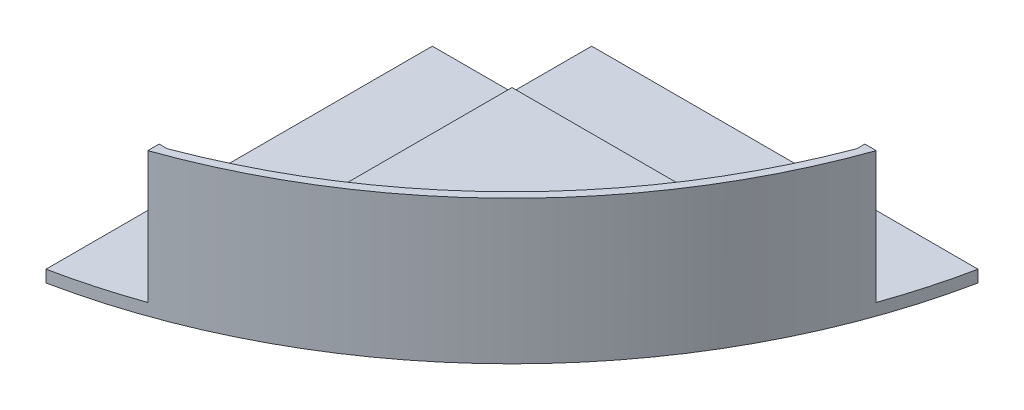
ISO-10303-21;
HEADER;
FILE_DESCRIPTION(('STEP AP214'),'2;1');
FILE_NAME('part.step','',(''),(''),'','','');
FILE_SCHEMA(('AUTOMOTIVE_DESIGN { 1 0 10303 214 1 1 1 1 }'));
ENDSEC;
DATA;
#1=APPLICATION_CONTEXT('core data for automotive mechanical design processes');
#2=APPLICATION_PROTOCOL_DEFINITION('international standard','automotive_design',2000,#1);
#3=PRODUCT_CONTEXT('',#1,'mechanical');
#4=PRODUCT('Part','Part','',(#3));
#5=PRODUCT_RELATED_PRODUCT_CATEGORY('part','',(#4));
#6=PRODUCT_DEFINITION_FORMATION('','',#4);
#7=PRODUCT_DEFINITION_CONTEXT('part definition',#1,'design');
#8=PRODUCT_DEFINITION('design','',#6,#7);
#9=PRODUCT_DEFINITION_SHAPE('','',#8);
#10=(LENGTH_UNIT() NAMED_UNIT(*) SI_UNIT(.MILLI.,.METRE.));
#11=(NAMED_UNIT(*) PLANE_ANGLE_UNIT() SI_UNIT($,.RADIAN.));
#12=(NAMED_UNIT(*) SI_UNIT($,.STERADIAN.) SOLID_ANGLE_UNIT());
#13=UNCERTAINTY_MEASURE_WITH_UNIT(LENGTH_MEASURE(1.E-05),#10,'distance_accuracy_value','');
#14=(GEOMETRIC_REPRESENTATION_CONTEXT(3) GLOBAL_UNCERTAINTY_ASSIGNED_CONTEXT((#13)) GLOBAL_UNIT_ASSIGNED_CONTEXT((#10,
#11,#12)) REPRESENTATION_CONTEXT('',''));
#15=CARTESIAN_POINT('',(0.,0.,0.));
#16=DIRECTION('',(0.,0.,1.));
#17=DIRECTION('',(1.,0.,0.));
#18=AXIS2_PLACEMENT_3D('',#15,#16,#17);
#19=CARTESIAN_POINT('',(0.,3.,0.));
#20=DIRECTION('',(0.,-1.,0.));
#21=DIRECTION('',(0.,0.,-1.));
#22=AXIS2_PLACEMENT_3D('',#19,#20,#21);
#23=CYLINDRICAL_SURFACE('',#22,148.);
#24=DIRECTION('',(0.,-1.,0.));
#25=VECTOR('',#24,1.);
#26=CARTESIAN_POINT('',(138.56406460551,36.,52.));
#27=LINE('',#26,#25);
#28=CARTESIAN_POINT('',(138.56406460551,36.,52.));
#29=VERTEX_POINT('',#28);
#30=CARTESIAN_POINT('',(138.56406460551,6.,52.));
#31=VERTEX_POINT('',#30);
#32=EDGE_CURVE('E168',#29,#31,#27,.T.);
#33=ORIENTED_EDGE('',*,*,#32,.T.);
#34=CARTESIAN_POINT('',(-1.27675647831893E-12,6.,-1.27675647831893E-12));
#35=DIRECTION('',(0.,-1.,0.));
#36=DIRECTION('',(0.,0.,-1.));
#37=AXIS2_PLACEMENT_3D('',#34,#35,#36);
#38=CIRCLE('',#37,148.000000000002);
#39=CARTESIAN_POINT('',(52.,6.,138.56406460551));
#40=VERTEX_POINT('',#39);
#41=EDGE_CURVE('E159',#40,#31,#38,.F.);
#42=ORIENTED_EDGE('',*,*,#41,.F.);
#43=DIRECTION('',(0.,-1.,0.));
#44=VECTOR('',#43,1.);
#45=CARTESIAN_POINT('',(52.,36.,138.56406460551));
#46=LINE('',#45,#44);
#47=CARTESIAN_POINT('',(52.,36.,138.56406460551));
#48=VERTEX_POINT('',#47);
#49=EDGE_CURVE('E166',#48,#40,#46,.T.);
#50=ORIENTED_EDGE('',*,*,#49,.F.);
#51=CARTESIAN_POINT('',(0.,36.,0.));
#52=DIRECTION('',(0.,1.,0.));
#53=DIRECTION('',(0.,0.,1.));
#54=AXIS2_PLACEMENT_3D('',#51,#52,#53);
#55=CIRCLE('',#54,148.);
#56=EDGE_CURVE('E174',#48,#29,#55,.T.);
#57=ORIENTED_EDGE('',*,*,#56,.T.);
#58=EDGE_LOOP('',(#33,#42,#50,#57));
#59=FACE_BOUND('',#58,.T.);
#60=ADVANCED_FACE('F37',(#59),#23,.F.);
#61=CARTESIAN_POINT('',(-40.3230520964318,36.,88.4846922834953));
#62=DIRECTION('',(0.,1.,0.));
#63=DIRECTION('',(0.,0.,1.));
#64=AXIS2_PLACEMENT_3D('',#61,#62,#63);
#65=PLANE('',#64);
#66=DIRECTION('',(1.,0.,0.));
#67=VECTOR('',#66,1.);
#68=CARTESIAN_POINT('',(49.,36.,138.56406460551));
#69=LINE('',#68,#67);
#70=CARTESIAN_POINT('',(50.,36.,138.56406460551));
#71=VERTEX_POINT('',#70);
#72=EDGE_CURVE('E172',#71,#48,#69,.T.);
#73=ORIENTED_EDGE('',*,*,#72,.F.);
#74=DIRECTION('',(0.,0.,1.));
#75=VECTOR('',#74,1.);
#76=CARTESIAN_POINT('',(50.,36.,88.4846922834953));
#77=LINE('',#76,#75);
#78=CARTESIAN_POINT('',(50.,36.,141.42135623731));
#79=VERTEX_POINT('',#78);
#80=EDGE_CURVE('E182',#71,#79,#77,.T.);
#81=ORIENTED_EDGE('',*,*,#80,.T.);
#82=CARTESIAN_POINT('',(0.,36.,0.));
#83=DIRECTION('',(0.,1.,0.));
#84=DIRECTION('',(0.,0.,1.));
#85=AXIS2_PLACEMENT_3D('',#82,#83,#84);
#86=CIRCLE('',#85,150.);
#87=CARTESIAN_POINT('',(141.42135623731,36.,50.));
#88=VERTEX_POINT('',#87);
#89=EDGE_CURVE('E184',#79,#88,#86,.T.);
#90=ORIENTED_EDGE('',*,*,#89,.T.);
#91=DIRECTION('',(1.,0.,0.));
#92=VECTOR('',#91,1.);
#93=CARTESIAN_POINT('',(-40.3230520964318,36.,50.));
#94=LINE('',#93,#92);
#95=CARTESIAN_POINT('',(138.56406460551,36.,50.));
#96=VERTEX_POINT('',#95);
#97=EDGE_CURVE('E180',#96,#88,#94,.T.);
#98=ORIENTED_EDGE('',*,*,#97,.F.);
#99=DIRECTION('',(0.,0.,1.));
#100=VECTOR('',#99,1.);
#101=CARTESIAN_POINT('',(138.56406460551,36.,49.));
#102=LINE('',#101,#100);
#103=EDGE_CURVE('E306',#96,#29,#102,.T.);
#104=ORIENTED_EDGE('',*,*,#103,.T.);
#105=ORIENTED_EDGE('',*,*,#56,.F.);
#106=EDGE_LOOP('',(#73,#81,#90,#98,#104,#105));
#107=FACE_BOUND('',#106,.T.);
#108=ADVANCED_FACE('F259',(#107),#65,.T.);
#109=CARTESIAN_POINT('',(50.,3.,88.4846922834954));
#110=DIRECTION('',(1.,0.,0.));
#111=DIRECTION('',(0.,0.,-1.));
#112=AXIS2_PLACEMENT_3D('',#109,#110,#111);
#113=PLANE('',#112);
#114=DIRECTION('',(0.,0.,1.));
#115=VECTOR('',#114,1.);
#116=CARTESIAN_POINT('',(50.,0.,88.4846922834954));
#117=LINE('',#116,#115);
#118=CARTESIAN_POINT('',(50.,0.,30.));
#119=VERTEX_POINT('',#118);
#120=CARTESIAN_POINT('',(50.,0.,50.));
#121=VERTEX_POINT('',#120);
#122=EDGE_CURVE('E225',#119,#121,#117,.T.);
#123=ORIENTED_EDGE('',*,*,#122,.T.);
#124=DIRECTION('',(0.,-1.,0.));
#125=VECTOR('',#124,1.);
#126=CARTESIAN_POINT('',(50.,3.,50.));
#127=LINE('',#126,#125);
#128=CARTESIAN_POINT('',(50.,3.,50.));
#129=VERTEX_POINT('',#128);
#130=EDGE_CURVE('E11',#129,#121,#127,.T.);
#131=ORIENTED_EDGE('',*,*,#130,.F.);
#132=DIRECTION('',(0.,0.,1.));
#133=VECTOR('',#132,1.);
#134=CARTESIAN_POINT('',(50.,3.,88.4846922834954));
#135=LINE('',#134,#133);
#136=CARTESIAN_POINT('',(50.,3.,30.));
#137=VERTEX_POINT('',#136);
#138=EDGE_CURVE('E189',#137,#129,#135,.T.);
#139=ORIENTED_EDGE('',*,*,#138,.F.);
#140=DIRECTION('',(0.,-1.,0.));
#141=VECTOR('',#140,1.);
#142=CARTESIAN_POINT('',(50.,3.,30.));
#143=LINE('',#142,#141);
#144=EDGE_CURVE('E64',#137,#119,#143,.T.);
#145=ORIENTED_EDGE('',*,*,#144,.T.);
#146=EDGE_LOOP('',(#123,#131,#139,#145));
#147=FACE_BOUND('',#146,.T.);
#148=ADVANCED_FACE('F39',(#147),#113,.F.);
#149=CARTESIAN_POINT('',(-40.3230520964318,3.,50.));
#150=DIRECTION('',(0.,0.,-1.));
#151=DIRECTION('',(-1.,0.,0.));
#152=AXIS2_PLACEMENT_3D('',#149,#150,#151);
#153=PLANE('',#152);
#154=DIRECTION('',(1.,0.,0.));
#155=VECTOR('',#154,1.);
#156=CARTESIAN_POINT('',(-40.3230520964318,0.,50.));
#157=LINE('',#156,#155);
#158=CARTESIAN_POINT('',(30.,0.,50.));
#159=VERTEX_POINT('',#158);
#160=EDGE_CURVE('E223',#159,#121,#157,.T.);
#161=ORIENTED_EDGE('',*,*,#160,.F.);
#162=DIRECTION('',(0.,-1.,0.));
#163=VECTOR('',#162,1.);
#164=CARTESIAN_POINT('',(30.,3.,50.));
#165=LINE('',#164,#163);
#166=CARTESIAN_POINT('',(30.,3.,50.));
#167=VERTEX_POINT('',#166);
#168=EDGE_CURVE('E47',#167,#159,#165,.T.);
#169=ORIENTED_EDGE('',*,*,#168,.F.);
#170=DIRECTION('',(1.,0.,0.));
#171=VECTOR('',#170,1.);
#172=CARTESIAN_POINT('',(-40.3230520964318,3.,50.));
#173=LINE('',#172,#171);
#174=EDGE_CURVE('E192',#167,#129,#173,.T.);
#175=ORIENTED_EDGE('',*,*,#174,.T.);
#176=ORIENTED_EDGE('',*,*,#130,.T.);
#177=EDGE_LOOP('',(#161,#169,#175,#176));
#178=FACE_BOUND('',#177,.T.);
#179=ADVANCED_FACE('F257',(#178),#153,.T.);
#180=CARTESIAN_POINT('',(30.,3.,88.4846922834954));
#181=DIRECTION('',(1.,0.,0.));
#182=DIRECTION('',(0.,0.,-1.));
#183=AXIS2_PLACEMENT_3D('',#180,#181,#182);
#184=PLANE('',#183);
#185=DIRECTION('',(0.,0.,1.));
#186=VECTOR('',#185,1.);
#187=CARTESIAN_POINT('',(30.,0.,88.4846922834954));
#188=LINE('',#187,#186);
#189=CARTESIAN_POINT('',(30.,0.,146.969384566991));
#190=VERTEX_POINT('',#189);
#191=EDGE_CURVE('E221',#159,#190,#188,.T.);
#192=ORIENTED_EDGE('',*,*,#191,.T.);
#193=DIRECTION('',(0.,-1.,0.));
#194=VECTOR('',#193,1.);
#195=CARTESIAN_POINT('',(30.,3.,146.969384566991));
#196=LINE('',#195,#194);
#197=CARTESIAN_POINT('',(30.,3.,146.969384566991));
#198=VERTEX_POINT('',#197);
#199=EDGE_CURVE('E210',#198,#190,#196,.T.);
#200=ORIENTED_EDGE('',*,*,#199,.F.);
#201=DIRECTION('',(0.,0.,1.));
#202=VECTOR('',#201,1.);
#203=CARTESIAN_POINT('',(30.,3.,88.4846922834954));
#204=LINE('',#203,#202);
#205=EDGE_CURVE('E195',#167,#198,#204,.T.);
#206=ORIENTED_EDGE('',*,*,#205,.F.);
#207=ORIENTED_EDGE('',*,*,#168,.T.);
#208=EDGE_LOOP('',(#192,#200,#206,#207));
#209=FACE_BOUND('',#208,.T.);
#210=ADVANCED_FACE('F264',(#209),#184,.F.);
#211=CARTESIAN_POINT('',(0.,3.,0.));
#212=DIRECTION('',(0.,-1.,0.));
#213=DIRECTION('',(0.,0.,-1.));
#214=AXIS2_PLACEMENT_3D('',#211,#212,#213);
#215=CYLINDRICAL_SURFACE('',#214,150.);
#216=CARTESIAN_POINT('',(0.,0.,0.));
#217=DIRECTION('',(0.,1.,0.));
#218=DIRECTION('',(0.,0.,1.));
#219=AXIS2_PLACEMENT_3D('',#216,#217,#218);
#220=CIRCLE('',#219,150.);
#221=CARTESIAN_POINT('',(146.969384566991,0.,30.));
#222=VERTEX_POINT('',#221);
#223=EDGE_CURVE('E218',#190,#222,#220,.T.);
#224=ORIENTED_EDGE('',*,*,#223,.T.);
#225=DIRECTION('',(0.,-1.,0.));
#226=VECTOR('',#225,1.);
#227=CARTESIAN_POINT('',(146.969384566991,3.,30.));
#228=LINE('',#227,#226);
#229=CARTESIAN_POINT('',(146.969384566991,3.,30.));
#230=VERTEX_POINT('',#229);
#231=EDGE_CURVE('E213',#230,#222,#228,.T.);
#232=ORIENTED_EDGE('',*,*,#231,.F.);
#233=CARTESIAN_POINT('',(0.,3.,0.));
#234=DIRECTION('',(0.,1.,0.));
#235=DIRECTION('',(0.,0.,1.));
#236=AXIS2_PLACEMENT_3D('',#233,#234,#235);
#237=CIRCLE('',#236,150.);
#238=CARTESIAN_POINT('',(141.42135623731,3.,50.));
#239=VERTEX_POINT('',#238);
#240=EDGE_CURVE('E197',#239,#230,#237,.T.);
#241=ORIENTED_EDGE('',*,*,#240,.F.);
#242=DIRECTION('',(0.,-1.,0.));
#243=VECTOR('',#242,1.);
#244=CARTESIAN_POINT('',(141.42135623731,36.,50.));
#245=LINE('',#244,#243);
#246=EDGE_CURVE('E186',#88,#239,#245,.T.);
#247=ORIENTED_EDGE('',*,*,#246,.F.);
#248=ORIENTED_EDGE('',*,*,#89,.F.);
#249=DIRECTION('',(0.,-1.,0.));
#250=VECTOR('',#249,1.);
#251=CARTESIAN_POINT('',(50.,36.,141.42135623731));
#252=LINE('',#251,#250);
#253=CARTESIAN_POINT('',(50.,3.,141.42135623731));
#254=VERTEX_POINT('',#253);
#255=EDGE_CURVE('E226',#79,#254,#252,.T.);
#256=ORIENTED_EDGE('',*,*,#255,.T.);
#257=EDGE_CURVE('E206',#198,#254,#237,.T.);
#258=ORIENTED_EDGE('',*,*,#257,.F.);
#259=ORIENTED_EDGE('',*,*,#199,.T.);
#260=EDGE_LOOP('',(#224,#232,#241,#247,#248,#256,#258,#259));
#261=FACE_BOUND('',#260,.T.);
#262=ADVANCED_FACE('F246',(#261),#215,.T.);
#263=CARTESIAN_POINT('',(-40.3230520964318,3.,30.));
#264=DIRECTION('',(0.,0.,-1.));
#265=DIRECTION('',(-1.,0.,0.));
#266=AXIS2_PLACEMENT_3D('',#263,#264,#265);
#267=PLANE('',#266);
#268=DIRECTION('',(1.,0.,0.));
#269=VECTOR('',#268,1.);
#270=CARTESIAN_POINT('',(-40.3230520964318,0.,30.));
#271=LINE('',#270,#269);
#272=EDGE_CURVE('E193',#119,#222,#271,.T.);
#273=ORIENTED_EDGE('',*,*,#272,.F.);
#274=ORIENTED_EDGE('',*,*,#144,.F.);
#275=DIRECTION('',(1.,0.,0.));
#276=VECTOR('',#275,1.);
#277=CARTESIAN_POINT('',(-40.3230520964318,3.,30.));
#278=LINE('',#277,#276);
#279=EDGE_CURVE('E200',#137,#230,#278,.T.);
#280=ORIENTED_EDGE('',*,*,#279,.T.);
#281=ORIENTED_EDGE('',*,*,#231,.T.);
#282=EDGE_LOOP('',(#273,#274,#280,#281));
#283=FACE_BOUND('',#282,.T.);
#284=ADVANCED_FACE('F251',(#283),#267,.T.);
#285=CARTESIAN_POINT('',(-40.3230520964318,3.,88.4846922834954));
#286=DIRECTION('',(0.,1.,0.));
#287=DIRECTION('',(0.,0.,1.));
#288=AXIS2_PLACEMENT_3D('',#285,#286,#287);
#289=PLANE('',#288);
#290=ORIENTED_EDGE('',*,*,#138,.T.);
#291=ORIENTED_EDGE('',*,*,#174,.F.);
#292=ORIENTED_EDGE('',*,*,#205,.T.);
#293=ORIENTED_EDGE('',*,*,#257,.T.);
#294=DIRECTION('',(0.,0.,1.));
#295=VECTOR('',#294,1.);
#296=CARTESIAN_POINT('',(50.,3.,88.4846922834953));
#297=LINE('',#296,#295);
#298=CARTESIAN_POINT('',(50.,3.,138.56406460551));
#299=VERTEX_POINT('',#298);
#300=EDGE_CURVE('E41',#299,#254,#297,.T.);
#301=ORIENTED_EDGE('',*,*,#300,.F.);
#302=DIRECTION('',(1.,0.,0.));
#303=VECTOR('',#302,1.);
#304=CARTESIAN_POINT('',(49.,3.,138.56406460551));
#305=LINE('',#304,#303);
#306=CARTESIAN_POINT('',(52.,3.,138.56406460551));
#307=VERTEX_POINT('',#306);
#308=EDGE_CURVE('E294',#299,#307,#305,.T.);
#309=ORIENTED_EDGE('',*,*,#308,.T.);
#310=DIRECTION('',(0.,0.,-1.));
#311=VECTOR('',#310,1.);
#312=CARTESIAN_POINT('',(52.,3.,138.56406460551));
#313=LINE('',#312,#311);
#314=CARTESIAN_POINT('',(52.,3.,52.));
#315=VERTEX_POINT('',#314);
#316=EDGE_CURVE('E149',#307,#315,#313,.T.);
#317=ORIENTED_EDGE('',*,*,#316,.T.);
#318=DIRECTION('',(1.,0.,0.));
#319=VECTOR('',#318,1.);
#320=CARTESIAN_POINT('',(94.2820323027551,3.,52.));
#321=LINE('',#320,#319);
#322=CARTESIAN_POINT('',(138.56406460551,3.,52.));
#323=VERTEX_POINT('',#322);
#324=EDGE_CURVE('E298',#315,#323,#321,.T.);
#325=ORIENTED_EDGE('',*,*,#324,.T.);
#326=DIRECTION('',(0.,0.,1.));
#327=VECTOR('',#326,1.);
#328=CARTESIAN_POINT('',(138.56406460551,3.,49.));
#329=LINE('',#328,#327);
#330=CARTESIAN_POINT('',(138.56406460551,3.,50.));
#331=VERTEX_POINT('',#330);
#332=EDGE_CURVE('E301',#331,#323,#329,.T.);
#333=ORIENTED_EDGE('',*,*,#332,.F.);
#334=DIRECTION('',(1.,0.,0.));
#335=VECTOR('',#334,1.);
#336=CARTESIAN_POINT('',(-40.3230520964318,3.,50.));
#337=LINE('',#336,#335);
#338=EDGE_CURVE('E55',#331,#239,#337,.T.);
#339=ORIENTED_EDGE('',*,*,#338,.T.);
#340=ORIENTED_EDGE('',*,*,#240,.T.);
#341=ORIENTED_EDGE('',*,*,#279,.F.);
#342=EDGE_LOOP('',(#290,#291,#292,#293,#301,#309,#317,#325,#333,#339,#340,#341));
#343=FACE_BOUND('',#342,.T.);
#344=ADVANCED_FACE('F249',(#343),#289,.T.);
#345=CARTESIAN_POINT('',(-40.3230520964318,0.,88.4846922834954));
#346=DIRECTION('',(0.,1.,0.));
#347=DIRECTION('',(0.,0.,1.));
#348=AXIS2_PLACEMENT_3D('',#345,#346,#347);
#349=PLANE('',#348);
#350=ORIENTED_EDGE('',*,*,#122,.F.);
#351=ORIENTED_EDGE('',*,*,#272,.T.);
#352=ORIENTED_EDGE('',*,*,#223,.F.);
#353=ORIENTED_EDGE('',*,*,#191,.F.);
#354=ORIENTED_EDGE('',*,*,#160,.T.);
#355=EDGE_LOOP('',(#350,#351,#352,#353,#354));
#356=FACE_BOUND('',#355,.T.);
#357=ADVANCED_FACE('F256',(#356),#349,.F.);
#358=CARTESIAN_POINT('',(-40.3230520964318,36.,50.));
#359=DIRECTION('',(0.,0.,-1.));
#360=DIRECTION('',(-1.,0.,0.));
#361=AXIS2_PLACEMENT_3D('',#358,#359,#360);
#362=PLANE('',#361);
#363=DIRECTION('',(0.,-1.,0.));
#364=VECTOR('',#363,1.);
#365=CARTESIAN_POINT('',(138.56406460551,36.,50.));
#366=LINE('',#365,#364);
#367=EDGE_CURVE('E179',#96,#331,#366,.T.);
#368=ORIENTED_EDGE('',*,*,#367,.F.);
#369=ORIENTED_EDGE('',*,*,#97,.T.);
#370=ORIENTED_EDGE('',*,*,#246,.T.);
#371=ORIENTED_EDGE('',*,*,#338,.F.);
#372=EDGE_LOOP('',(#368,#369,#370,#371));
#373=FACE_BOUND('',#372,.T.);
#374=ADVANCED_FACE('F244',(#373),#362,.T.);
#375=CARTESIAN_POINT('',(50.,36.,88.4846922834953));
#376=DIRECTION('',(1.,0.,0.));
#377=DIRECTION('',(0.,0.,-1.));
#378=AXIS2_PLACEMENT_3D('',#375,#376,#377);
#379=PLANE('',#378);
#380=ORIENTED_EDGE('',*,*,#80,.F.);
#381=DIRECTION('',(0.,-1.,0.));
#382=VECTOR('',#381,1.);
#383=CARTESIAN_POINT('',(50.,36.,138.56406460551));
#384=LINE('',#383,#382);
#385=EDGE_CURVE('E297',#71,#299,#384,.T.);
#386=ORIENTED_EDGE('',*,*,#385,.T.);
#387=ORIENTED_EDGE('',*,*,#300,.T.);
#388=ORIENTED_EDGE('',*,*,#255,.F.);
#389=EDGE_LOOP('',(#380,#386,#387,#388));
#390=FACE_BOUND('',#389,.T.);
#391=ADVANCED_FACE('F275',(#390),#379,.F.);
#392=CARTESIAN_POINT('',(138.56406460551,-54.9299983269761,49.));
#393=DIRECTION('',(1.,0.,0.));
#394=DIRECTION('',(0.,0.,-1.));
#395=AXIS2_PLACEMENT_3D('',#392,#393,#394);
#396=PLANE('',#395);
#397=ORIENTED_EDGE('',*,*,#367,.T.);
#398=ORIENTED_EDGE('',*,*,#332,.T.);
#399=DIRECTION('',(0.,-1.,0.));
#400=VECTOR('',#399,1.);
#401=CARTESIAN_POINT('',(138.56406460551,6.,52.));
#402=LINE('',#401,#400);
#403=EDGE_CURVE('E314',#31,#323,#402,.T.);
#404=ORIENTED_EDGE('',*,*,#403,.F.);
#405=ORIENTED_EDGE('',*,*,#32,.F.);
#406=ORIENTED_EDGE('',*,*,#103,.F.);
#407=EDGE_LOOP('',(#397,#398,#404,#405,#406));
#408=FACE_BOUND('',#407,.T.);
#409=ADVANCED_FACE('F272',(#408),#396,.F.);
#410=CARTESIAN_POINT('',(49.,36.,138.56406460551));
#411=DIRECTION('',(0.,0.,1.));
#412=DIRECTION('',(1.,0.,0.));
#413=AXIS2_PLACEMENT_3D('',#410,#411,#412);
#414=PLANE('',#413);
#415=ORIENTED_EDGE('',*,*,#72,.T.);
#416=ORIENTED_EDGE('',*,*,#49,.T.);
#417=DIRECTION('',(0.,-1.,0.));
#418=VECTOR('',#417,1.);
#419=CARTESIAN_POINT('',(52.,6.,138.56406460551));
#420=LINE('',#419,#418);
#421=EDGE_CURVE('E142',#40,#307,#420,.T.);
#422=ORIENTED_EDGE('',*,*,#421,.T.);
#423=ORIENTED_EDGE('',*,*,#308,.F.);
#424=ORIENTED_EDGE('',*,*,#385,.F.);
#425=EDGE_LOOP('',(#415,#416,#422,#423,#424));
#426=FACE_BOUND('',#425,.T.);
#427=ADVANCED_FACE('F170',(#426),#414,.F.);
#428=CARTESIAN_POINT('',(88.4846922834953,6.,52.));
#429=DIRECTION('',(0.,0.,-1.));
#430=DIRECTION('',(-1.,0.,0.));
#431=AXIS2_PLACEMENT_3D('',#428,#429,#430);
#432=PLANE('',#431);
#433=ORIENTED_EDGE('',*,*,#403,.T.);
#434=ORIENTED_EDGE('',*,*,#324,.F.);
#435=DIRECTION('',(0.,-1.,0.));
#436=VECTOR('',#435,1.);
#437=CARTESIAN_POINT('',(52.,6.,52.));
#438=LINE('',#437,#436);
#439=CARTESIAN_POINT('',(52.,6.,52.));
#440=VERTEX_POINT('',#439);
#441=EDGE_CURVE('E153',#440,#315,#438,.T.);
#442=ORIENTED_EDGE('',*,*,#441,.F.);
#443=DIRECTION('',(1.,0.,0.));
#444=VECTOR('',#443,1.);
#445=CARTESIAN_POINT('',(88.4846922834953,6.,52.));
#446=LINE('',#445,#444);
#447=EDGE_CURVE('E154',#440,#31,#446,.T.);
#448=ORIENTED_EDGE('',*,*,#447,.T.);
#449=EDGE_LOOP('',(#433,#434,#442,#448));
#450=FACE_BOUND('',#449,.T.);
#451=ADVANCED_FACE('F313',(#450),#432,.T.);
#452=CARTESIAN_POINT('',(52.,6.,-40.3230520964318));
#453=DIRECTION('',(-1.,0.,0.));
#454=DIRECTION('',(0.,0.,1.));
#455=AXIS2_PLACEMENT_3D('',#452,#453,#454);
#456=PLANE('',#455);
#457=ORIENTED_EDGE('',*,*,#441,.T.);
#458=ORIENTED_EDGE('',*,*,#316,.F.);
#459=ORIENTED_EDGE('',*,*,#421,.F.);
#460=DIRECTION('',(0.,0.,-1.));
#461=VECTOR('',#460,1.);
#462=CARTESIAN_POINT('',(52.,6.,-40.3230520964318));
#463=LINE('',#462,#461);
#464=EDGE_CURVE('E146',#40,#440,#463,.T.);
#465=ORIENTED_EDGE('',*,*,#464,.T.);
#466=EDGE_LOOP('',(#457,#458,#459,#465));
#467=FACE_BOUND('',#466,.T.);
#468=ADVANCED_FACE('F145',(#467),#456,.T.);
#469=CARTESIAN_POINT('',(88.4846922834953,6.,-40.3230520964318));
#470=DIRECTION('',(0.,-1.,0.));
#471=DIRECTION('',(0.,0.,-1.));
#472=AXIS2_PLACEMENT_3D('',#469,#470,#471);
#473=PLANE('',#472);
#474=ORIENTED_EDGE('',*,*,#41,.T.);
#475=ORIENTED_EDGE('',*,*,#447,.F.);
#476=ORIENTED_EDGE('',*,*,#464,.F.);
#477=EDGE_LOOP('',(#474,#475,#476));
#478=FACE_BOUND('',#477,.T.);
#479=ADVANCED_FACE('F158',(#478),#473,.F.);
#480=CLOSED_SHELL('',(#60,#108,#148,#179,#210,#262,#284,#344,#357,#374,#391,#409,#427,#451,#468,#479));
#481=MANIFOLD_SOLID_BREP('B2',#480);
#482=ADVANCED_BREP_SHAPE_REPRESENTATION('',(#18,#481),#14);
#483=SHAPE_DEFINITION_REPRESENTATION(#9,#482);
ENDSEC;
END-ISO-10303-21;
